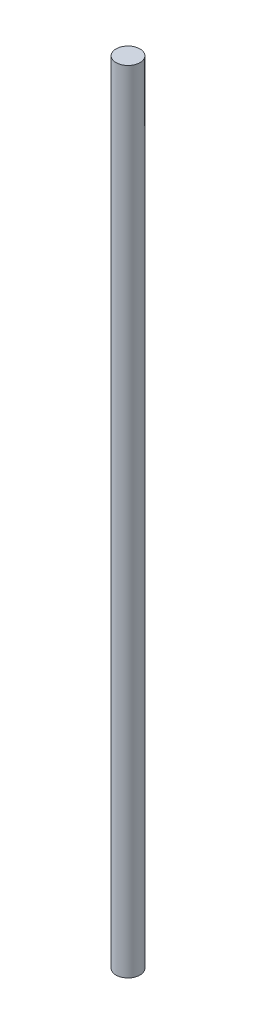
ISO-10303-21;
HEADER;
FILE_DESCRIPTION(('STEP AP214'),'2;1');
FILE_NAME('part.step','',(''),(''),'','','');
FILE_SCHEMA(('AUTOMOTIVE_DESIGN { 1 0 10303 214 1 1 1 1 }'));
ENDSEC;
DATA;
#1=APPLICATION_CONTEXT('core data for automotive mechanical design processes');
#2=APPLICATION_PROTOCOL_DEFINITION('international standard','automotive_design',2000,#1);
#3=PRODUCT_CONTEXT('',#1,'mechanical');
#4=PRODUCT('Part','Part','',(#3));
#5=PRODUCT_RELATED_PRODUCT_CATEGORY('part','',(#4));
#6=PRODUCT_DEFINITION_FORMATION('','',#4);
#7=PRODUCT_DEFINITION_CONTEXT('part definition',#1,'design');
#8=PRODUCT_DEFINITION('design','',#6,#7);
#9=PRODUCT_DEFINITION_SHAPE('','',#8);
#10=(LENGTH_UNIT() NAMED_UNIT(*) SI_UNIT(.MILLI.,.METRE.));
#11=(NAMED_UNIT(*) PLANE_ANGLE_UNIT() SI_UNIT($,.RADIAN.));
#12=(NAMED_UNIT(*) SI_UNIT($,.STERADIAN.) SOLID_ANGLE_UNIT());
#13=UNCERTAINTY_MEASURE_WITH_UNIT(LENGTH_MEASURE(1.E-05),#10,'distance_accuracy_value','');
#14=(GEOMETRIC_REPRESENTATION_CONTEXT(3) GLOBAL_UNCERTAINTY_ASSIGNED_CONTEXT((#13)) GLOBAL_UNIT_ASSIGNED_CONTEXT((#10,
#11,#12)) REPRESENTATION_CONTEXT('',''));
#15=CARTESIAN_POINT('',(0.,0.,0.));
#16=DIRECTION('',(0.,0.,1.));
#17=DIRECTION('',(1.,0.,0.));
#18=AXIS2_PLACEMENT_3D('',#15,#16,#17);
#19=CARTESIAN_POINT('',(0.,331.,0.));
#20=DIRECTION('',(0.,-1.,0.));
#21=DIRECTION('',(0.,0.,-1.));
#22=AXIS2_PLACEMENT_3D('',#19,#20,#21);
#23=CYLINDRICAL_SURFACE('',#22,5.);
#24=CARTESIAN_POINT('',(0.,331.,0.));
#25=DIRECTION('',(0.,1.,0.));
#26=DIRECTION('',(0.,0.,1.));
#27=AXIS2_PLACEMENT_3D('',#24,#25,#26);
#28=CIRCLE('',#27,5.);
#29=CARTESIAN_POINT('',(0.,331.,5.));
#30=VERTEX_POINT('',#29);
#31=EDGE_CURVE('E10',#30,#30,#28,.T.);
#32=ORIENTED_EDGE('',*,*,#31,.F.);
#33=EDGE_LOOP('',(#32));
#34=FACE_BOUND('',#33,.T.);
#35=CARTESIAN_POINT('',(0.,0.,0.));
#36=DIRECTION('',(0.,1.,0.));
#37=DIRECTION('',(0.,0.,1.));
#38=AXIS2_PLACEMENT_3D('',#35,#36,#37);
#39=CIRCLE('',#38,5.);
#40=CARTESIAN_POINT('',(0.,0.,5.));
#41=VERTEX_POINT('',#40);
#42=EDGE_CURVE('E35',#41,#41,#39,.T.);
#43=ORIENTED_EDGE('',*,*,#42,.T.);
#44=EDGE_LOOP('',(#43));
#45=FACE_BOUND('',#44,.T.);
#46=ADVANCED_FACE('F32',(#34,#45),#23,.T.);
#47=CARTESIAN_POINT('',(0.,331.,0.));
#48=DIRECTION('',(0.,1.,0.));
#49=DIRECTION('',(0.,0.,1.));
#50=AXIS2_PLACEMENT_3D('',#47,#48,#49);
#51=PLANE('',#50);
#52=ORIENTED_EDGE('',*,*,#31,.T.);
#53=EDGE_LOOP('',(#52));
#54=FACE_BOUND('',#53,.T.);
#55=ADVANCED_FACE('F47',(#54),#51,.T.);
#56=CARTESIAN_POINT('',(0.,0.,0.));
#57=DIRECTION('',(0.,1.,0.));
#58=DIRECTION('',(0.,0.,1.));
#59=AXIS2_PLACEMENT_3D('',#56,#57,#58);
#60=PLANE('',#59);
#61=ORIENTED_EDGE('',*,*,#42,.F.);
#62=EDGE_LOOP('',(#61));
#63=FACE_BOUND('',#62,.T.);
#64=ADVANCED_FACE('F45',(#63),#60,.F.);
#65=CLOSED_SHELL('',(#46,#55,#64));
#66=MANIFOLD_SOLID_BREP('B2',#65);
#67=ADVANCED_BREP_SHAPE_REPRESENTATION('',(#18,#66),#14);
#68=SHAPE_DEFINITION_REPRESENTATION(#9,#67);
ENDSEC;
END-ISO-10303-21;
